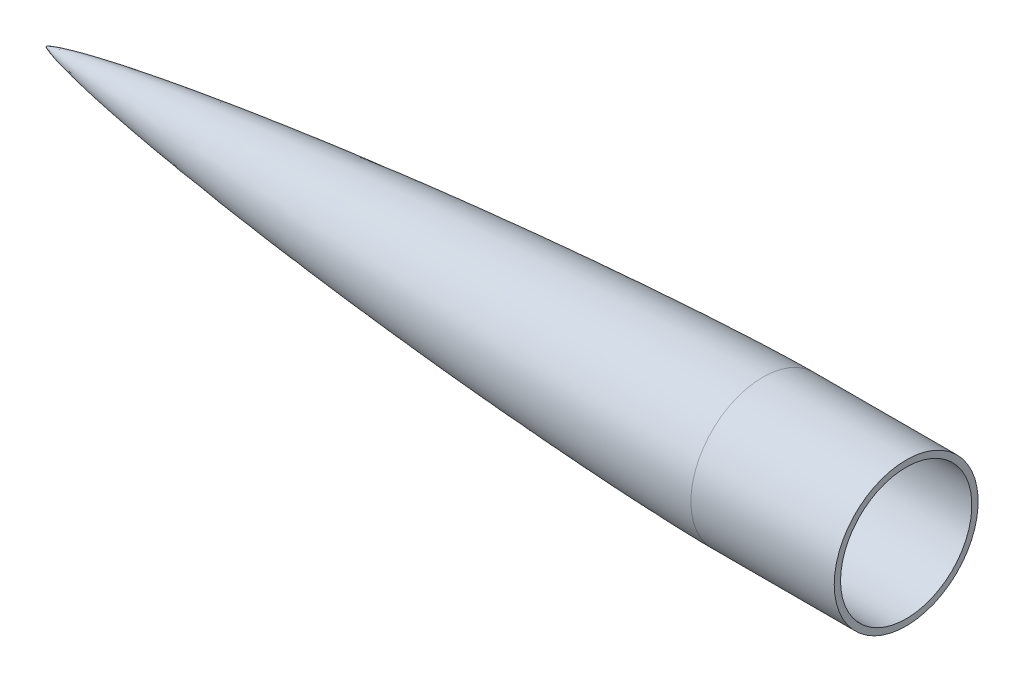
ISO-10303-21;
HEADER;
FILE_DESCRIPTION(('STEP AP214'),'2;1');
FILE_NAME('part.step','',(''),(''),'','','');
FILE_SCHEMA(('AUTOMOTIVE_DESIGN { 1 0 10303 214 1 1 1 1 }'));
ENDSEC;
DATA;
#1=APPLICATION_CONTEXT('core data for automotive mechanical design processes');
#2=APPLICATION_PROTOCOL_DEFINITION('international standard','automotive_design',2000,#1);
#3=PRODUCT_CONTEXT('',#1,'mechanical');
#4=PRODUCT('Part','Part','',(#3));
#5=PRODUCT_RELATED_PRODUCT_CATEGORY('part','',(#4));
#6=PRODUCT_DEFINITION_FORMATION('','',#4);
#7=PRODUCT_DEFINITION_CONTEXT('part definition',#1,'design');
#8=PRODUCT_DEFINITION('design','',#6,#7);
#9=PRODUCT_DEFINITION_SHAPE('','',#8);
#10=(LENGTH_UNIT() NAMED_UNIT(*) SI_UNIT(.MILLI.,.METRE.));
#11=(NAMED_UNIT(*) PLANE_ANGLE_UNIT() SI_UNIT($,.RADIAN.));
#12=(NAMED_UNIT(*) SI_UNIT($,.STERADIAN.) SOLID_ANGLE_UNIT());
#13=UNCERTAINTY_MEASURE_WITH_UNIT(LENGTH_MEASURE(1.E-05),#10,'distance_accuracy_value','');
#14=(GEOMETRIC_REPRESENTATION_CONTEXT(3) GLOBAL_UNCERTAINTY_ASSIGNED_CONTEXT((#13)) GLOBAL_UNIT_ASSIGNED_CONTEXT((#10,
#11,#12)) REPRESENTATION_CONTEXT('',''));
#15=CARTESIAN_POINT('',(0.,0.,0.));
#16=DIRECTION('',(0.,0.,1.));
#17=DIRECTION('',(1.,0.,0.));
#18=AXIS2_PLACEMENT_3D('',#15,#16,#17);
#19=CARTESIAN_POINT('',(190.50034116909,14.5415,0.));
#20=DIRECTION('',(-1.,0.,0.));
#21=DIRECTION('',(0.,0.,1.));
#22=AXIS2_PLACEMENT_3D('',#19,#20,#21);
#23=PLANE('',#22);
#24=CARTESIAN_POINT('',(190.50034116909,0.,0.));
#25=DIRECTION('',(-1.,0.,0.));
#26=DIRECTION('',(0.,0.,1.));
#27=AXIS2_PLACEMENT_3D('',#24,#25,#26);
#28=CIRCLE('',#27,15.9351015355275);
#29=CARTESIAN_POINT('',(190.50034116909,0.,15.9351015355275));
#30=VERTEX_POINT('',#29);
#31=EDGE_CURVE('E11',#30,#30,#28,.T.);
#32=ORIENTED_EDGE('',*,*,#31,.F.);
#33=EDGE_LOOP('',(#32));
#34=FACE_BOUND('',#33,.T.);
#35=CARTESIAN_POINT('',(190.50034116909,0.,0.));
#36=DIRECTION('',(-1.,0.,0.));
#37=DIRECTION('',(0.,0.,1.));
#38=AXIS2_PLACEMENT_3D('',#35,#36,#37);
#39=CIRCLE('',#38,14.5415);
#40=CARTESIAN_POINT('',(190.50034116909,0.,14.5415));
#41=VERTEX_POINT('',#40);
#42=EDGE_CURVE('E57',#41,#41,#39,.T.);
#43=ORIENTED_EDGE('',*,*,#42,.T.);
#44=EDGE_LOOP('',(#43));
#45=FACE_BOUND('',#44,.T.);
#46=ADVANCED_FACE('F37',(#34,#45),#23,.F.);
#47=CARTESIAN_POINT('',(0.,0.,0.));
#48=DIRECTION('',(-1.,0.,0.));
#49=DIRECTION('',(0.,0.,1.));
#50=AXIS2_PLACEMENT_3D('',#47,#48,#49);
#51=CYLINDRICAL_SURFACE('',#50,15.9351015355275);
#52=CARTESIAN_POINT('',(158.75034116909,0.,0.));
#53=DIRECTION('',(-1.,0.,0.));
#54=DIRECTION('',(0.,0.,1.));
#55=AXIS2_PLACEMENT_3D('',#52,#53,#54);
#56=CIRCLE('',#55,15.9351015355275);
#57=CARTESIAN_POINT('',(158.75034116909,0.,15.9351015355275));
#58=VERTEX_POINT('',#57);
#59=EDGE_CURVE('E43',#58,#58,#56,.T.);
#60=ORIENTED_EDGE('',*,*,#59,.F.);
#61=EDGE_LOOP('',(#60));
#62=FACE_BOUND('',#61,.T.);
#63=ORIENTED_EDGE('',*,*,#31,.T.);
#64=EDGE_LOOP('',(#63));
#65=FACE_BOUND('',#64,.T.);
#66=ADVANCED_FACE('F50',(#62,#65),#51,.T.);
#67=CARTESIAN_POINT('',(158.75034116909,15.9351015355275,0.));
#68=CARTESIAN_POINT('',(157.741947302825,15.9315955677096,0.));
#69=CARTESIAN_POINT('',(155.725298405597,15.9049354275613,0.));
#70=CARTESIAN_POINT('',(151.252666170002,15.8116233721761,0.));
#71=CARTESIAN_POINT('',(144.325799068979,15.5884950141087,0.));
#72=CARTESIAN_POINT('',(135.954420270119,15.2356483843253,0.));
#73=CARTESIAN_POINT('',(123.686950328288,14.5993730539197,0.));
#74=CARTESIAN_POINT('',(111.427056111483,13.8290661515495,0.));
#75=CARTESIAN_POINT('',(99.1750543542869,12.9428908526076,0.));
#76=CARTESIAN_POINT('',(86.9317641051847,11.9449965505136,0.));
#77=CARTESIAN_POINT('',(77.1428424642405,11.0795224824516,0.));
#78=CARTESIAN_POINT('',(67.3602742946687,10.144793971025,0.));
#79=CARTESIAN_POINT('',(57.5850240081398,9.13639116930488,0.));
#80=CARTESIAN_POINT('',(47.8184014347138,8.04720150811809,0.));
#81=CARTESIAN_POINT('',(38.062563292031,6.86514932930778,0.));
#82=CARTESIAN_POINT('',(28.3207738679534,5.57135236593119,0.));
#83=CARTESIAN_POINT('',(19.5643836653552,4.27301132062494,0.));
#84=CARTESIAN_POINT('',(12.3436977681104,3.05822795528767,0.));
#85=CARTESIAN_POINT('',(7.08806890965737,2.0289024183938,0.));
#86=CARTESIAN_POINT('',(4.00199925598395,1.32617980806627,0.));
#87=CARTESIAN_POINT('',(2.23444938924788,0.856904850130732,0.));
#88=CARTESIAN_POINT('',(1.29331891471744,0.568162571339806,0.));
#89=CARTESIAN_POINT('',(0.7816740395079,0.388965163735398,0.));
#90=CARTESIAN_POINT('',(0.495029028290093,0.275770881095257,0.));
#91=CARTESIAN_POINT('',(0.324070964310856,0.200600292204971,0.));
#92=CARTESIAN_POINT('',(0.208942401624536,0.144612333740538,0.));
#93=CARTESIAN_POINT('',(0.127121393720751,0.09999398982901,0.));
#94=CARTESIAN_POINT('',(0.069928145543012,0.0644673140679682,0.));
#95=CARTESIAN_POINT('',(0.0301618946821,0.0344928060717065,0.));
#96=CARTESIAN_POINT('',(0.0105093167861656,0.0166145439848414,0.));
#97=CARTESIAN_POINT('',(0.00307763780483389,0.00584990022075085,0.));
#98=CARTESIAN_POINT('',(0.,0.,0.));
#99=B_SPLINE_CURVE_WITH_KNOTS('',4,(#67,#68,#69,#70,#71,#72,#73,#74,#75,#76,#77,#78,#79,#80,#81,
#82,#83,#84,#85,#86,#87,#88,#89,#90,#91,#92,#93,#94,#95,#96,#97,#98),.UNSPECIFIED.,.F.,.F.,(5,1,
1,1,1,1,1,1,1,1,1,1,1,1,1,1,1,1,1,1,1,1,1,1,1,1,1,1,5),(0.,0.0252364757770966,
0.0504729515541932,0.111956783848437,0.173440616613771,0.234924448139904,0.357892113200986,
0.419375945043068,0.48085977672419,0.54234360867085,0.603827440752769,0.665311272793739,
0.726795104520483,0.788278935504806,0.849762765439761,0.911246600579924,0.948321656784141,
0.971507961834644,0.983774221825455,0.99044264550484,0.994079849967674,0.996138716455756,
0.997338357152711,0.998153400512665,0.998752915596009,0.999341294387686,0.999670647193843,
0.999835323596921,1.),.UNSPECIFIED.);
#100=CARTESIAN_POINT('',(0.,0.,0.));
#101=DIRECTION('',(-1.,0.,0.));
#102=AXIS1_PLACEMENT('',#100,#101);
#103=SURFACE_OF_REVOLUTION('',#99,#102);
#104=CARTESIAN_POINT('',(0.,0.,0.));
#105=VERTEX_POINT('',#104);
#106=VERTEX_LOOP('',#105);
#107=FACE_BOUND('',#106,.T.);
#108=ORIENTED_EDGE('',*,*,#59,.T.);
#109=EDGE_LOOP('',(#108));
#110=FACE_BOUND('',#109,.T.);
#111=ADVANCED_FACE('F46',(#107,#110),#103,.T.);
#112=CARTESIAN_POINT('',(158.74999999999,0.,0.));
#113=DIRECTION('',(-1.,0.,0.));
#114=DIRECTION('',(0.,0.,1.));
#115=AXIS2_PLACEMENT_3D('',#112,#113,#114);
#116=PLANE('',#115);
#117=CARTESIAN_POINT('',(158.74999999999,0.,0.));
#118=DIRECTION('',(-1.,0.,0.));
#119=DIRECTION('',(0.,0.,1.));
#120=AXIS2_PLACEMENT_3D('',#117,#118,#119);
#121=CIRCLE('',#120,14.5415);
#122=CARTESIAN_POINT('',(158.74999999999,0.,14.5415));
#123=VERTEX_POINT('',#122);
#124=EDGE_CURVE('E55',#123,#123,#121,.T.);
#125=ORIENTED_EDGE('',*,*,#124,.F.);
#126=EDGE_LOOP('',(#125));
#127=FACE_BOUND('',#126,.T.);
#128=ADVANCED_FACE('F49',(#127),#116,.F.);
#129=CARTESIAN_POINT('',(0.,0.,0.));
#130=DIRECTION('',(-1.,0.,0.));
#131=DIRECTION('',(0.,0.,1.));
#132=AXIS2_PLACEMENT_3D('',#129,#130,#131);
#133=CYLINDRICAL_SURFACE('',#132,14.5415);
#134=ORIENTED_EDGE('',*,*,#42,.F.);
#135=EDGE_LOOP('',(#134));
#136=FACE_BOUND('',#135,.T.);
#137=ORIENTED_EDGE('',*,*,#124,.T.);
#138=EDGE_LOOP('',(#137));
#139=FACE_BOUND('',#138,.T.);
#140=ADVANCED_FACE('F80',(#136,#139),#133,.F.);
#141=CLOSED_SHELL('',(#46,#66,#111,#128,#140));
#142=MANIFOLD_SOLID_BREP('B2',#141);
#143=ADVANCED_BREP_SHAPE_REPRESENTATION('',(#18,#142),#14);
#144=SHAPE_DEFINITION_REPRESENTATION(#9,#143);
ENDSEC;
END-ISO-10303-21;
